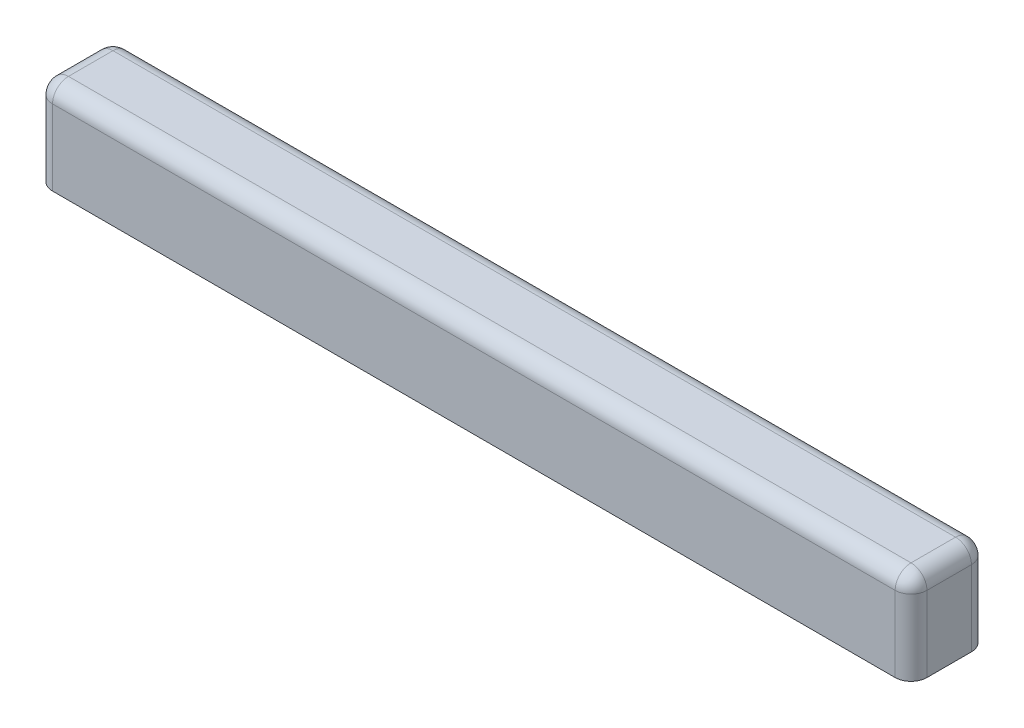
ISO-10303-21;
HEADER;
FILE_DESCRIPTION(('STEP AP214'),'2;1');
FILE_NAME('part.step','',(''),(''),'','','');
FILE_SCHEMA(('AUTOMOTIVE_DESIGN { 1 0 10303 214 1 1 1 1 }'));
ENDSEC;
DATA;
#1=APPLICATION_CONTEXT('core data for automotive mechanical design processes');
#2=APPLICATION_PROTOCOL_DEFINITION('international standard','automotive_design',2000,#1);
#3=PRODUCT_CONTEXT('',#1,'mechanical');
#4=PRODUCT('Part','Part','',(#3));
#5=PRODUCT_RELATED_PRODUCT_CATEGORY('part','',(#4));
#6=PRODUCT_DEFINITION_FORMATION('','',#4);
#7=PRODUCT_DEFINITION_CONTEXT('part definition',#1,'design');
#8=PRODUCT_DEFINITION('design','',#6,#7);
#9=PRODUCT_DEFINITION_SHAPE('','',#8);
#10=(LENGTH_UNIT() NAMED_UNIT(*) SI_UNIT(.MILLI.,.METRE.));
#11=(NAMED_UNIT(*) PLANE_ANGLE_UNIT() SI_UNIT($,.RADIAN.));
#12=(NAMED_UNIT(*) SI_UNIT($,.STERADIAN.) SOLID_ANGLE_UNIT());
#13=UNCERTAINTY_MEASURE_WITH_UNIT(LENGTH_MEASURE(1.E-05),#10,'distance_accuracy_value','');
#14=(GEOMETRIC_REPRESENTATION_CONTEXT(3) GLOBAL_UNCERTAINTY_ASSIGNED_CONTEXT((#13)) GLOBAL_UNIT_ASSIGNED_CONTEXT((#10,
#11,#12)) REPRESENTATION_CONTEXT('',''));
#15=CARTESIAN_POINT('',(0.,0.,0.));
#16=DIRECTION('',(0.,0.,1.));
#17=DIRECTION('',(1.,0.,0.));
#18=AXIS2_PLACEMENT_3D('',#15,#16,#17);
#19=CARTESIAN_POINT('',(55.,11.5,4.8));
#20=DIRECTION('',(-1.,0.,0.));
#21=DIRECTION('',(0.,0.,1.));
#22=AXIS2_PLACEMENT_3D('',#19,#20,#21);
#23=PLANE('',#22);
#24=DIRECTION('',(0.,0.,-1.));
#25=VECTOR('',#24,1.);
#26=CARTESIAN_POINT('',(55.,0.,4.8));
#27=LINE('',#26,#25);
#28=CARTESIAN_POINT('',(55.,0.,2.8));
#29=VERTEX_POINT('',#28);
#30=CARTESIAN_POINT('',(55.,0.,-2.8));
#31=VERTEX_POINT('',#30);
#32=EDGE_CURVE('E197',#29,#31,#27,.T.);
#33=ORIENTED_EDGE('',*,*,#32,.T.);
#34=DIRECTION('',(0.,-1.,0.));
#35=VECTOR('',#34,1.);
#36=CARTESIAN_POINT('',(55.,11.5,-2.8));
#37=LINE('',#36,#35);
#38=CARTESIAN_POINT('',(55.,9.5,-2.8));
#39=VERTEX_POINT('',#38);
#40=EDGE_CURVE('E49',#31,#39,#37,.F.);
#41=ORIENTED_EDGE('',*,*,#40,.T.);
#42=DIRECTION('',(0.,0.,-1.));
#43=VECTOR('',#42,1.);
#44=CARTESIAN_POINT('',(55.,9.5,4.8));
#45=LINE('',#44,#43);
#46=CARTESIAN_POINT('',(55.,9.5,2.8));
#47=VERTEX_POINT('',#46);
#48=EDGE_CURVE('E54',#39,#47,#45,.F.);
#49=ORIENTED_EDGE('',*,*,#48,.T.);
#50=DIRECTION('',(0.,-1.,0.));
#51=VECTOR('',#50,1.);
#52=CARTESIAN_POINT('',(55.,11.5,2.8));
#53=LINE('',#52,#51);
#54=EDGE_CURVE('E166',#47,#29,#53,.T.);
#55=ORIENTED_EDGE('',*,*,#54,.T.);
#56=EDGE_LOOP('',(#33,#41,#49,#55));
#57=FACE_BOUND('',#56,.T.);
#58=ADVANCED_FACE('F32',(#57),#23,.F.);
#59=CARTESIAN_POINT('',(-55.,11.5,-4.8));
#60=DIRECTION('',(0.,0.,1.));
#61=DIRECTION('',(1.,0.,0.));
#62=AXIS2_PLACEMENT_3D('',#59,#60,#61);
#63=PLANE('',#62);
#64=DIRECTION('',(-1.,0.,0.));
#65=VECTOR('',#64,1.);
#66=CARTESIAN_POINT('',(-55.,0.,-4.8));
#67=LINE('',#66,#65);
#68=CARTESIAN_POINT('',(53.,0.,-4.8));
#69=VERTEX_POINT('',#68);
#70=CARTESIAN_POINT('',(-53.,0.,-4.8));
#71=VERTEX_POINT('',#70);
#72=EDGE_CURVE('E199',#69,#71,#67,.T.);
#73=ORIENTED_EDGE('',*,*,#72,.T.);
#74=DIRECTION('',(0.,-1.,0.));
#75=VECTOR('',#74,1.);
#76=CARTESIAN_POINT('',(-53.,11.5,-4.8));
#77=LINE('',#76,#75);
#78=CARTESIAN_POINT('',(-53.,9.5,-4.8));
#79=VERTEX_POINT('',#78);
#80=EDGE_CURVE('E164',#71,#79,#77,.F.);
#81=ORIENTED_EDGE('',*,*,#80,.T.);
#82=DIRECTION('',(-1.,0.,0.));
#83=VECTOR('',#82,1.);
#84=CARTESIAN_POINT('',(-55.,9.5,-4.8));
#85=LINE('',#84,#83);
#86=CARTESIAN_POINT('',(53.,9.5,-4.8));
#87=VERTEX_POINT('',#86);
#88=EDGE_CURVE('E162',#79,#87,#85,.F.);
#89=ORIENTED_EDGE('',*,*,#88,.T.);
#90=DIRECTION('',(0.,-1.,0.));
#91=VECTOR('',#90,1.);
#92=CARTESIAN_POINT('',(53.,11.5,-4.8));
#93=LINE('',#92,#91);
#94=EDGE_CURVE('E160',#87,#69,#93,.T.);
#95=ORIENTED_EDGE('',*,*,#94,.T.);
#96=EDGE_LOOP('',(#73,#81,#89,#95));
#97=FACE_BOUND('',#96,.T.);
#98=ADVANCED_FACE('F252',(#97),#63,.F.);
#99=CARTESIAN_POINT('',(-55.,11.5,4.8));
#100=DIRECTION('',(1.,0.,0.));
#101=DIRECTION('',(0.,0.,-1.));
#102=AXIS2_PLACEMENT_3D('',#99,#100,#101);
#103=PLANE('',#102);
#104=DIRECTION('',(0.,0.,1.));
#105=VECTOR('',#104,1.);
#106=CARTESIAN_POINT('',(-55.,9.5,4.8));
#107=LINE('',#106,#105);
#108=CARTESIAN_POINT('',(-55.,9.5,2.8));
#109=VERTEX_POINT('',#108);
#110=CARTESIAN_POINT('',(-55.,9.5,-2.8));
#111=VERTEX_POINT('',#110);
#112=EDGE_CURVE('E156',#109,#111,#107,.F.);
#113=ORIENTED_EDGE('',*,*,#112,.T.);
#114=DIRECTION('',(0.,-1.,0.));
#115=VECTOR('',#114,1.);
#116=CARTESIAN_POINT('',(-55.,11.5,-2.8));
#117=LINE('',#116,#115);
#118=CARTESIAN_POINT('',(-55.,0.,-2.8));
#119=VERTEX_POINT('',#118);
#120=EDGE_CURVE('E158',#111,#119,#117,.T.);
#121=ORIENTED_EDGE('',*,*,#120,.T.);
#122=DIRECTION('',(0.,0.,1.));
#123=VECTOR('',#122,1.);
#124=CARTESIAN_POINT('',(-55.,0.,4.8));
#125=LINE('',#124,#123);
#126=CARTESIAN_POINT('',(-55.,0.,2.8));
#127=VERTEX_POINT('',#126);
#128=EDGE_CURVE('E203',#119,#127,#125,.T.);
#129=ORIENTED_EDGE('',*,*,#128,.T.);
#130=DIRECTION('',(0.,-1.,0.));
#131=VECTOR('',#130,1.);
#132=CARTESIAN_POINT('',(-55.,11.5,2.8));
#133=LINE('',#132,#131);
#134=EDGE_CURVE('E154',#127,#109,#133,.F.);
#135=ORIENTED_EDGE('',*,*,#134,.T.);
#136=EDGE_LOOP('',(#113,#121,#129,#135));
#137=FACE_BOUND('',#136,.T.);
#138=ADVANCED_FACE('F257',(#137),#103,.F.);
#139=CARTESIAN_POINT('',(-55.,11.5,4.8));
#140=DIRECTION('',(0.,0.,-1.));
#141=DIRECTION('',(-1.,0.,0.));
#142=AXIS2_PLACEMENT_3D('',#139,#140,#141);
#143=PLANE('',#142);
#144=DIRECTION('',(1.,0.,0.));
#145=VECTOR('',#144,1.);
#146=CARTESIAN_POINT('',(-55.,9.5,4.8));
#147=LINE('',#146,#145);
#148=CARTESIAN_POINT('',(53.,9.5,4.8));
#149=VERTEX_POINT('',#148);
#150=CARTESIAN_POINT('',(-53.,9.5,4.8));
#151=VERTEX_POINT('',#150);
#152=EDGE_CURVE('E117',#149,#151,#147,.F.);
#153=ORIENTED_EDGE('',*,*,#152,.T.);
#154=DIRECTION('',(0.,-1.,0.));
#155=VECTOR('',#154,1.);
#156=CARTESIAN_POINT('',(-53.,11.5,4.8));
#157=LINE('',#156,#155);
#158=CARTESIAN_POINT('',(-53.,0.,4.8));
#159=VERTEX_POINT('',#158);
#160=EDGE_CURVE('E152',#151,#159,#157,.T.);
#161=ORIENTED_EDGE('',*,*,#160,.T.);
#162=DIRECTION('',(1.,0.,0.));
#163=VECTOR('',#162,1.);
#164=CARTESIAN_POINT('',(-55.,0.,4.8));
#165=LINE('',#164,#163);
#166=CARTESIAN_POINT('',(53.,0.,4.8));
#167=VERTEX_POINT('',#166);
#168=EDGE_CURVE('E139',#159,#167,#165,.T.);
#169=ORIENTED_EDGE('',*,*,#168,.T.);
#170=DIRECTION('',(0.,-1.,0.));
#171=VECTOR('',#170,1.);
#172=CARTESIAN_POINT('',(53.,11.5,4.8));
#173=LINE('',#172,#171);
#174=EDGE_CURVE('E145',#167,#149,#173,.F.);
#175=ORIENTED_EDGE('',*,*,#174,.T.);
#176=EDGE_LOOP('',(#153,#161,#169,#175));
#177=FACE_BOUND('',#176,.T.);
#178=ADVANCED_FACE('F228',(#177),#143,.F.);
#179=CARTESIAN_POINT('',(0.,11.5,0.));
#180=DIRECTION('',(0.,-1.,0.));
#181=DIRECTION('',(0.,0.,-1.));
#182=AXIS2_PLACEMENT_3D('',#179,#180,#181);
#183=PLANE('',#182);
#184=DIRECTION('',(0.,0.,1.));
#185=VECTOR('',#184,1.);
#186=CARTESIAN_POINT('',(-53.,11.5,0.));
#187=LINE('',#186,#185);
#188=CARTESIAN_POINT('',(-53.,11.5,-2.8));
#189=VERTEX_POINT('',#188);
#190=CARTESIAN_POINT('',(-53.,11.5,2.8));
#191=VERTEX_POINT('',#190);
#192=EDGE_CURVE('E143',#189,#191,#187,.T.);
#193=ORIENTED_EDGE('',*,*,#192,.T.);
#194=DIRECTION('',(1.,0.,0.));
#195=VECTOR('',#194,1.);
#196=CARTESIAN_POINT('',(0.,11.5,2.8));
#197=LINE('',#196,#195);
#198=CARTESIAN_POINT('',(53.,11.5,2.8));
#199=VERTEX_POINT('',#198);
#200=EDGE_CURVE('E115',#191,#199,#197,.T.);
#201=ORIENTED_EDGE('',*,*,#200,.T.);
#202=DIRECTION('',(0.,0.,-1.));
#203=VECTOR('',#202,1.);
#204=CARTESIAN_POINT('',(53.,11.5,0.));
#205=LINE('',#204,#203);
#206=CARTESIAN_POINT('',(53.,11.5,-2.8));
#207=VERTEX_POINT('',#206);
#208=EDGE_CURVE('E132',#199,#207,#205,.T.);
#209=ORIENTED_EDGE('',*,*,#208,.T.);
#210=DIRECTION('',(-1.,0.,0.));
#211=VECTOR('',#210,1.);
#212=CARTESIAN_POINT('',(0.,11.5,-2.8));
#213=LINE('',#212,#211);
#214=EDGE_CURVE('E138',#207,#189,#213,.T.);
#215=ORIENTED_EDGE('',*,*,#214,.T.);
#216=EDGE_LOOP('',(#193,#201,#209,#215));
#217=FACE_BOUND('',#216,.T.);
#218=ADVANCED_FACE('F141',(#217),#183,.F.);
#219=CARTESIAN_POINT('',(0.,0.,0.));
#220=DIRECTION('',(0.,-1.,0.));
#221=DIRECTION('',(0.,0.,-1.));
#222=AXIS2_PLACEMENT_3D('',#219,#220,#221);
#223=PLANE('',#222);
#224=ORIENTED_EDGE('',*,*,#128,.F.);
#225=CARTESIAN_POINT('',(-53.,0.,-2.8));
#226=DIRECTION('',(0.,-1.,0.));
#227=DIRECTION('',(0.,0.,-1.));
#228=AXIS2_PLACEMENT_3D('',#225,#226,#227);
#229=CIRCLE('',#228,2.);
#230=EDGE_CURVE('E11',#119,#71,#229,.T.);
#231=ORIENTED_EDGE('',*,*,#230,.T.);
#232=ORIENTED_EDGE('',*,*,#72,.F.);
#233=CARTESIAN_POINT('',(53.,0.,-2.8));
#234=DIRECTION('',(0.,-1.,0.));
#235=DIRECTION('',(0.,0.,-1.));
#236=AXIS2_PLACEMENT_3D('',#233,#234,#235);
#237=CIRCLE('',#236,2.);
#238=EDGE_CURVE('E172',#69,#31,#237,.T.);
#239=ORIENTED_EDGE('',*,*,#238,.T.);
#240=ORIENTED_EDGE('',*,*,#32,.F.);
#241=CARTESIAN_POINT('',(53.,0.,2.8));
#242=DIRECTION('',(0.,-1.,0.));
#243=DIRECTION('',(0.,0.,-1.));
#244=AXIS2_PLACEMENT_3D('',#241,#242,#243);
#245=CIRCLE('',#244,2.);
#246=EDGE_CURVE('E170',#29,#167,#245,.T.);
#247=ORIENTED_EDGE('',*,*,#246,.T.);
#248=ORIENTED_EDGE('',*,*,#168,.F.);
#249=CARTESIAN_POINT('',(-53.,0.,2.8));
#250=DIRECTION('',(0.,-1.,0.));
#251=DIRECTION('',(0.,0.,-1.));
#252=AXIS2_PLACEMENT_3D('',#249,#250,#251);
#253=CIRCLE('',#252,2.);
#254=EDGE_CURVE('E41',#159,#127,#253,.T.);
#255=ORIENTED_EDGE('',*,*,#254,.T.);
#256=EDGE_LOOP('',(#224,#231,#232,#239,#240,#247,#248,#255));
#257=FACE_BOUND('',#256,.T.);
#258=ADVANCED_FACE('F235',(#257),#223,.T.);
#259=CARTESIAN_POINT('',(-53.,11.5,-2.8));
#260=DIRECTION('',(0.,-1.,0.));
#261=DIRECTION('',(0.,0.,-1.));
#262=AXIS2_PLACEMENT_3D('',#259,#260,#261);
#263=CYLINDRICAL_SURFACE('',#262,2.);
#264=ORIENTED_EDGE('',*,*,#230,.F.);
#265=ORIENTED_EDGE('',*,*,#120,.F.);
#266=CARTESIAN_POINT('',(-53.,9.5,-2.8));
#267=DIRECTION('',(0.,1.,0.));
#268=DIRECTION('',(0.,0.,1.));
#269=AXIS2_PLACEMENT_3D('',#266,#267,#268);
#270=CIRCLE('',#269,2.);
#271=EDGE_CURVE('E36',#79,#111,#270,.T.);
#272=ORIENTED_EDGE('',*,*,#271,.F.);
#273=ORIENTED_EDGE('',*,*,#80,.F.);
#274=EDGE_LOOP('',(#264,#265,#272,#273));
#275=FACE_BOUND('',#274,.T.);
#276=ADVANCED_FACE('F34',(#275),#263,.T.);
#277=CARTESIAN_POINT('',(0.,9.5,-2.8));
#278=DIRECTION('',(-1.,0.,0.));
#279=DIRECTION('',(0.,0.,1.));
#280=AXIS2_PLACEMENT_3D('',#277,#278,#279);
#281=CYLINDRICAL_SURFACE('',#280,2.);
#282=CARTESIAN_POINT('',(53.,9.5,-2.8));
#283=DIRECTION('',(1.,0.,0.));
#284=DIRECTION('',(0.,0.,-1.));
#285=AXIS2_PLACEMENT_3D('',#282,#283,#284);
#286=CIRCLE('',#285,2.);
#287=EDGE_CURVE('E189',#87,#207,#286,.T.);
#288=ORIENTED_EDGE('',*,*,#287,.F.);
#289=ORIENTED_EDGE('',*,*,#88,.F.);
#290=CARTESIAN_POINT('',(-53.,9.5,-2.8));
#291=DIRECTION('',(-1.,0.,0.));
#292=DIRECTION('',(0.,0.,1.));
#293=AXIS2_PLACEMENT_3D('',#290,#291,#292);
#294=CIRCLE('',#293,2.);
#295=EDGE_CURVE('E191',#189,#79,#294,.T.);
#296=ORIENTED_EDGE('',*,*,#295,.F.);
#297=ORIENTED_EDGE('',*,*,#214,.F.);
#298=EDGE_LOOP('',(#288,#289,#296,#297));
#299=FACE_BOUND('',#298,.T.);
#300=ADVANCED_FACE('F212',(#299),#281,.T.);
#301=CARTESIAN_POINT('',(53.,11.5,-2.8));
#302=DIRECTION('',(0.,-1.,0.));
#303=DIRECTION('',(0.,0.,-1.));
#304=AXIS2_PLACEMENT_3D('',#301,#302,#303);
#305=CYLINDRICAL_SURFACE('',#304,2.);
#306=ORIENTED_EDGE('',*,*,#238,.F.);
#307=ORIENTED_EDGE('',*,*,#94,.F.);
#308=CARTESIAN_POINT('',(53.,9.5,-2.8));
#309=DIRECTION('',(0.,1.,0.));
#310=DIRECTION('',(0.,0.,1.));
#311=AXIS2_PLACEMENT_3D('',#308,#309,#310);
#312=CIRCLE('',#311,2.);
#313=EDGE_CURVE('E186',#39,#87,#312,.T.);
#314=ORIENTED_EDGE('',*,*,#313,.F.);
#315=ORIENTED_EDGE('',*,*,#40,.F.);
#316=EDGE_LOOP('',(#306,#307,#314,#315));
#317=FACE_BOUND('',#316,.T.);
#318=ADVANCED_FACE('F240',(#317),#305,.T.);
#319=CARTESIAN_POINT('',(-53.,9.5,-2.8));
#320=DIRECTION('',(0.,0.,-1.));
#321=DIRECTION('',(-1.,0.,0.));
#322=AXIS2_PLACEMENT_3D('',#319,#320,#321);
#323=SPHERICAL_SURFACE('',#322,2.);
#324=ORIENTED_EDGE('',*,*,#295,.T.);
#325=ORIENTED_EDGE('',*,*,#271,.T.);
#326=CARTESIAN_POINT('',(-53.,9.5,-2.8));
#327=DIRECTION('',(0.,0.,-1.));
#328=DIRECTION('',(-1.,0.,0.));
#329=AXIS2_PLACEMENT_3D('',#326,#327,#328);
#330=CIRCLE('',#329,2.);
#331=EDGE_CURVE('E183',#189,#111,#330,.F.);
#332=ORIENTED_EDGE('',*,*,#331,.F.);
#333=EDGE_LOOP('',(#324,#325,#332));
#334=FACE_BOUND('',#333,.T.);
#335=ADVANCED_FACE('F213',(#334),#323,.T.);
#336=CARTESIAN_POINT('',(53.,9.5,-2.8));
#337=DIRECTION('',(0.,0.,-1.));
#338=DIRECTION('',(-1.,0.,0.));
#339=AXIS2_PLACEMENT_3D('',#336,#337,#338);
#340=SPHERICAL_SURFACE('',#339,2.);
#341=ORIENTED_EDGE('',*,*,#313,.T.);
#342=ORIENTED_EDGE('',*,*,#287,.T.);
#343=CARTESIAN_POINT('',(53.,9.5,-2.8));
#344=DIRECTION('',(0.,0.,-1.));
#345=DIRECTION('',(-1.,0.,0.));
#346=AXIS2_PLACEMENT_3D('',#343,#344,#345);
#347=CIRCLE('',#346,2.);
#348=EDGE_CURVE('E135',#39,#207,#347,.F.);
#349=ORIENTED_EDGE('',*,*,#348,.F.);
#350=EDGE_LOOP('',(#341,#342,#349));
#351=FACE_BOUND('',#350,.T.);
#352=ADVANCED_FACE('F242',(#351),#340,.T.);
#353=CARTESIAN_POINT('',(-53.,11.5,2.8));
#354=DIRECTION('',(0.,-1.,0.));
#355=DIRECTION('',(0.,0.,-1.));
#356=AXIS2_PLACEMENT_3D('',#353,#354,#355);
#357=CYLINDRICAL_SURFACE('',#356,2.);
#358=ORIENTED_EDGE('',*,*,#254,.F.);
#359=ORIENTED_EDGE('',*,*,#160,.F.);
#360=CARTESIAN_POINT('',(-53.,9.5,2.8));
#361=DIRECTION('',(0.,1.,0.));
#362=DIRECTION('',(0.,0.,1.));
#363=AXIS2_PLACEMENT_3D('',#360,#361,#362);
#364=CIRCLE('',#363,2.);
#365=EDGE_CURVE('E179',#109,#151,#364,.T.);
#366=ORIENTED_EDGE('',*,*,#365,.F.);
#367=ORIENTED_EDGE('',*,*,#134,.F.);
#368=EDGE_LOOP('',(#358,#359,#366,#367));
#369=FACE_BOUND('',#368,.T.);
#370=ADVANCED_FACE('F225',(#369),#357,.T.);
#371=CARTESIAN_POINT('',(-53.,9.5,0.));
#372=DIRECTION('',(0.,0.,1.));
#373=DIRECTION('',(1.,0.,0.));
#374=AXIS2_PLACEMENT_3D('',#371,#372,#373);
#375=CYLINDRICAL_SURFACE('',#374,2.);
#376=ORIENTED_EDGE('',*,*,#331,.T.);
#377=ORIENTED_EDGE('',*,*,#112,.F.);
#378=CARTESIAN_POINT('',(-53.,9.5,2.8));
#379=DIRECTION('',(0.,0.,1.));
#380=DIRECTION('',(1.,0.,0.));
#381=AXIS2_PLACEMENT_3D('',#378,#379,#380);
#382=CIRCLE('',#381,2.);
#383=EDGE_CURVE('E129',#191,#109,#382,.T.);
#384=ORIENTED_EDGE('',*,*,#383,.F.);
#385=ORIENTED_EDGE('',*,*,#192,.F.);
#386=EDGE_LOOP('',(#376,#377,#384,#385));
#387=FACE_BOUND('',#386,.T.);
#388=ADVANCED_FACE('F216',(#387),#375,.T.);
#389=CARTESIAN_POINT('',(53.,9.5,0.));
#390=DIRECTION('',(0.,0.,-1.));
#391=DIRECTION('',(-1.,0.,0.));
#392=AXIS2_PLACEMENT_3D('',#389,#390,#391);
#393=CYLINDRICAL_SURFACE('',#392,2.);
#394=ORIENTED_EDGE('',*,*,#348,.T.);
#395=ORIENTED_EDGE('',*,*,#208,.F.);
#396=CARTESIAN_POINT('',(53.,9.5,2.8));
#397=DIRECTION('',(0.,0.,1.));
#398=DIRECTION('',(1.,0.,0.));
#399=AXIS2_PLACEMENT_3D('',#396,#397,#398);
#400=CIRCLE('',#399,2.);
#401=EDGE_CURVE('E123',#47,#199,#400,.T.);
#402=ORIENTED_EDGE('',*,*,#401,.F.);
#403=ORIENTED_EDGE('',*,*,#48,.F.);
#404=EDGE_LOOP('',(#394,#395,#402,#403));
#405=FACE_BOUND('',#404,.T.);
#406=ADVANCED_FACE('F133',(#405),#393,.T.);
#407=CARTESIAN_POINT('',(53.,11.5,2.8));
#408=DIRECTION('',(0.,-1.,0.));
#409=DIRECTION('',(0.,0.,-1.));
#410=AXIS2_PLACEMENT_3D('',#407,#408,#409);
#411=CYLINDRICAL_SURFACE('',#410,2.);
#412=ORIENTED_EDGE('',*,*,#246,.F.);
#413=ORIENTED_EDGE('',*,*,#54,.F.);
#414=CARTESIAN_POINT('',(53.,9.5,2.8));
#415=DIRECTION('',(0.,1.,0.));
#416=DIRECTION('',(0.,0.,1.));
#417=AXIS2_PLACEMENT_3D('',#414,#415,#416);
#418=CIRCLE('',#417,2.);
#419=EDGE_CURVE('E127',#149,#47,#418,.T.);
#420=ORIENTED_EDGE('',*,*,#419,.F.);
#421=ORIENTED_EDGE('',*,*,#174,.F.);
#422=EDGE_LOOP('',(#412,#413,#420,#421));
#423=FACE_BOUND('',#422,.T.);
#424=ADVANCED_FACE('F232',(#423),#411,.T.);
#425=CARTESIAN_POINT('',(-53.,9.5,2.8));
#426=DIRECTION('',(-1.,0.,0.));
#427=DIRECTION('',(0.,0.,1.));
#428=AXIS2_PLACEMENT_3D('',#425,#426,#427);
#429=SPHERICAL_SURFACE('',#428,2.);
#430=ORIENTED_EDGE('',*,*,#383,.T.);
#431=ORIENTED_EDGE('',*,*,#365,.T.);
#432=CARTESIAN_POINT('',(-53.,9.5,2.8));
#433=DIRECTION('',(-1.,0.,0.));
#434=DIRECTION('',(0.,0.,1.));
#435=AXIS2_PLACEMENT_3D('',#432,#433,#434);
#436=CIRCLE('',#435,2.);
#437=EDGE_CURVE('E120',#191,#151,#436,.F.);
#438=ORIENTED_EDGE('',*,*,#437,.F.);
#439=EDGE_LOOP('',(#430,#431,#438));
#440=FACE_BOUND('',#439,.T.);
#441=ADVANCED_FACE('F220',(#440),#429,.T.);
#442=CARTESIAN_POINT('',(53.,9.5,2.8));
#443=DIRECTION('',(1.,0.,0.));
#444=DIRECTION('',(0.,0.,-1.));
#445=AXIS2_PLACEMENT_3D('',#442,#443,#444);
#446=SPHERICAL_SURFACE('',#445,2.);
#447=ORIENTED_EDGE('',*,*,#419,.T.);
#448=ORIENTED_EDGE('',*,*,#401,.T.);
#449=CARTESIAN_POINT('',(53.,9.5,2.8));
#450=DIRECTION('',(1.,0.,0.));
#451=DIRECTION('',(0.,0.,-1.));
#452=AXIS2_PLACEMENT_3D('',#449,#450,#451);
#453=CIRCLE('',#452,2.);
#454=EDGE_CURVE('E111',#149,#199,#453,.F.);
#455=ORIENTED_EDGE('',*,*,#454,.F.);
#456=EDGE_LOOP('',(#447,#448,#455));
#457=FACE_BOUND('',#456,.T.);
#458=ADVANCED_FACE('F125',(#457),#446,.T.);
#459=CARTESIAN_POINT('',(0.,9.5,2.8));
#460=DIRECTION('',(1.,0.,0.));
#461=DIRECTION('',(0.,0.,-1.));
#462=AXIS2_PLACEMENT_3D('',#459,#460,#461);
#463=CYLINDRICAL_SURFACE('',#462,2.);
#464=ORIENTED_EDGE('',*,*,#437,.T.);
#465=ORIENTED_EDGE('',*,*,#152,.F.);
#466=ORIENTED_EDGE('',*,*,#454,.T.);
#467=ORIENTED_EDGE('',*,*,#200,.F.);
#468=EDGE_LOOP('',(#464,#465,#466,#467));
#469=FACE_BOUND('',#468,.T.);
#470=ADVANCED_FACE('F113',(#469),#463,.T.);
#471=CLOSED_SHELL('',(#58,#98,#138,#178,#218,#258,#276,#300,#318,#335,#352,#370,#388,#406,#424,
#441,#458,#470));
#472=MANIFOLD_SOLID_BREP('B2',#471);
#473=ADVANCED_BREP_SHAPE_REPRESENTATION('',(#18,#472),#14);
#474=SHAPE_DEFINITION_REPRESENTATION(#9,#473);
ENDSEC;
END-ISO-10303-21;
